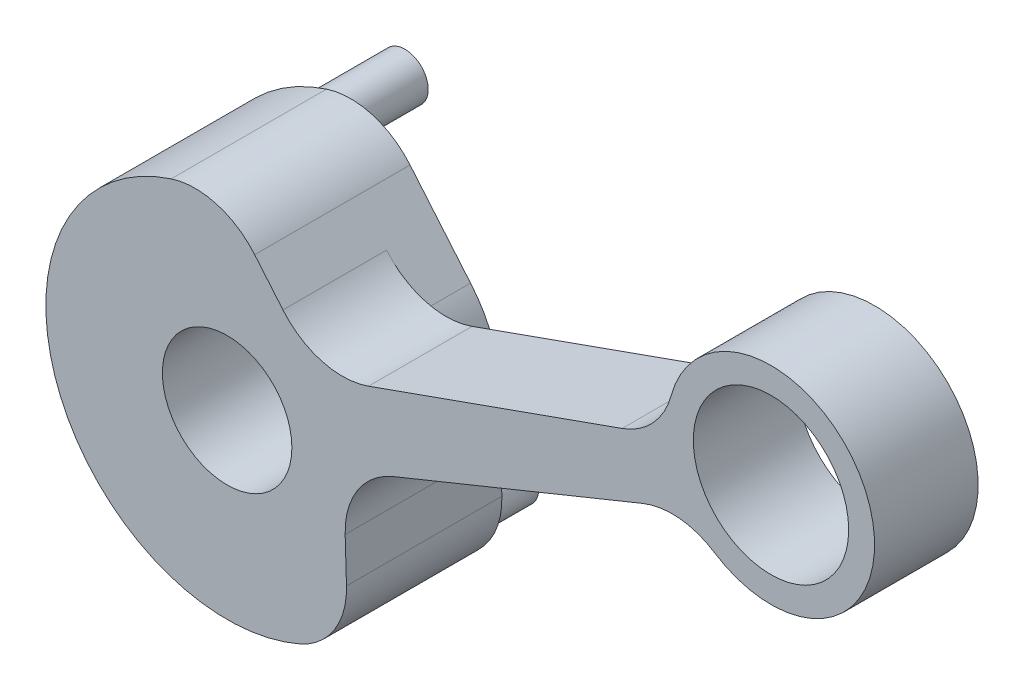
ISO-10303-21;
HEADER;
FILE_DESCRIPTION(('STEP AP214'),'2;1');
FILE_NAME('part.step','',(''),(''),'','','');
FILE_SCHEMA(('AUTOMOTIVE_DESIGN { 1 0 10303 214 1 1 1 1 }'));
ENDSEC;
DATA;
#1=APPLICATION_CONTEXT('core data for automotive mechanical design processes');
#2=APPLICATION_PROTOCOL_DEFINITION('international standard','automotive_design',2000,#1);
#3=PRODUCT_CONTEXT('',#1,'mechanical');
#4=PRODUCT('Part','Part','',(#3));
#5=PRODUCT_RELATED_PRODUCT_CATEGORY('part','',(#4));
#6=PRODUCT_DEFINITION_FORMATION('','',#4);
#7=PRODUCT_DEFINITION_CONTEXT('part definition',#1,'design');
#8=PRODUCT_DEFINITION('design','',#6,#7);
#9=PRODUCT_DEFINITION_SHAPE('','',#8);
#10=(LENGTH_UNIT() NAMED_UNIT(*) SI_UNIT(.MILLI.,.METRE.));
#11=(NAMED_UNIT(*) PLANE_ANGLE_UNIT() SI_UNIT($,.RADIAN.));
#12=(NAMED_UNIT(*) SI_UNIT($,.STERADIAN.) SOLID_ANGLE_UNIT());
#13=UNCERTAINTY_MEASURE_WITH_UNIT(LENGTH_MEASURE(1.E-05),#10,'distance_accuracy_value','');
#14=(GEOMETRIC_REPRESENTATION_CONTEXT(3) GLOBAL_UNCERTAINTY_ASSIGNED_CONTEXT((#13)) GLOBAL_UNIT_ASSIGNED_CONTEXT((#10,
#11,#12)) REPRESENTATION_CONTEXT('',''));
#15=CARTESIAN_POINT('',(0.,0.,0.));
#16=DIRECTION('',(0.,0.,1.));
#17=DIRECTION('',(1.,0.,0.));
#18=AXIS2_PLACEMENT_3D('',#15,#16,#17);
#19=CARTESIAN_POINT('',(0.,0.,0.));
#20=DIRECTION('',(0.,0.,1.));
#21=DIRECTION('',(1.,0.,0.));
#22=AXIS2_PLACEMENT_3D('',#19,#20,#21);
#23=PLANE('',#22);
#24=CARTESIAN_POINT('',(21.,8.,0.));
#25=DIRECTION('',(0.,0.,1.));
#26=DIRECTION('',(1.,0.,0.));
#27=AXIS2_PLACEMENT_3D('',#24,#25,#26);
#28=CIRCLE('',#27,3.);
#29=CARTESIAN_POINT('',(24.,8.,0.));
#30=VERTEX_POINT('',#29);
#31=EDGE_CURVE('E235',#30,#30,#28,.T.);
#32=ORIENTED_EDGE('',*,*,#31,.T.);
#33=EDGE_LOOP('',(#32));
#34=FACE_BOUND('',#33,.T.);
#35=DIRECTION('',(0.642768314001691,-0.766060633706904,0.));
#36=VECTOR('',#35,1.);
#37=CARTESIAN_POINT('',(3.44679651365598,2.89205773839203,0.));
#38=LINE('',#37,#36);
#39=CARTESIAN_POINT('',(2.15513883452,4.43147416365268,0.));
#40=VERTEX_POINT('',#39);
#41=CARTESIAN_POINT('',(3.39871404419549,2.94936312545409,0.));
#42=VERTEX_POINT('',#41);
#43=EDGE_CURVE('E12',#40,#42,#38,.T.);
#44=ORIENTED_EDGE('',*,*,#43,.F.);
#45=CARTESIAN_POINT('',(4.45332073564071,6.35977910565776,0.));
#46=DIRECTION('',(0.,0.,1.));
#47=DIRECTION('',(1.,0.,0.));
#48=AXIS2_PLACEMENT_3D('',#45,#46,#47);
#49=CIRCLE('',#48,3.);
#50=CARTESIAN_POINT('',(5.45868165986985,3.53325307322269,0.));
#51=VERTEX_POINT('',#50);
#52=EDGE_CURVE('E295',#40,#51,#49,.T.);
#53=ORIENTED_EDGE('',*,*,#52,.T.);
#54=DIRECTION('',(0.942175344145023,0.33512030807638,0.));
#55=VECTOR('',#54,1.);
#56=CARTESIAN_POINT('',(-0.50255608243628,1.41291332846847,0.));
#57=LINE('',#56,#55);
#58=CARTESIAN_POINT('',(15.2524150031694,7.01676487983104,0.));
#59=VERTEX_POINT('',#58);
#60=EDGE_CURVE('E268',#51,#59,#57,.T.);
#61=ORIENTED_EDGE('',*,*,#60,.T.);
#62=CARTESIAN_POINT('',(14.2470540789403,9.84329091226611,0.));
#63=DIRECTION('',(0.,0.,1.));
#64=DIRECTION('',(1.,0.,0.));
#65=AXIS2_PLACEMENT_3D('',#62,#63,#64);
#66=CIRCLE('',#65,3.);
#67=CARTESIAN_POINT('',(17.1411737593944,9.05330909272349,0.));
#68=VERTEX_POINT('',#67);
#69=EDGE_CURVE('E327',#59,#68,#66,.T.);
#70=ORIENTED_EDGE('',*,*,#69,.T.);
#71=CARTESIAN_POINT('',(21.,8.,0.));
#72=DIRECTION('',(0.,0.,1.));
#73=DIRECTION('',(1.,0.,0.));
#74=AXIS2_PLACEMENT_3D('',#71,#72,#73);
#75=CIRCLE('',#74,4.);
#76=CARTESIAN_POINT('',(18.8200680444491,4.646211594455,0.));
#77=VERTEX_POINT('',#76);
#78=EDGE_CURVE('E264',#77,#68,#75,.T.);
#79=ORIENTED_EDGE('',*,*,#78,.F.);
#80=CARTESIAN_POINT('',(17.1851190777859,2.13087029029626,0.));
#81=DIRECTION('',(0.,0.,1.));
#82=DIRECTION('',(1.,0.,0.));
#83=AXIS2_PLACEMENT_3D('',#80,#81,#82);
#84=CIRCLE('',#83,3.);
#85=CARTESIAN_POINT('',(16.0550365461745,4.90988332944282,0.));
#86=VERTEX_POINT('',#85);
#87=EDGE_CURVE('E322',#77,#86,#84,.T.);
#88=ORIENTED_EDGE('',*,*,#87,.T.);
#89=DIRECTION('',(0.92633767971552,0.376694177203826,0.));
#90=VECTOR('',#89,1.);
#91=CARTESIAN_POINT('',(0.564901456013718,-1.38916270996278,0.));
#92=LINE('',#91,#90);
#93=CARTESIAN_POINT('',(6.42593270965101,0.994219067547162,0.));
#94=VERTEX_POINT('',#93);
#95=EDGE_CURVE('E220',#94,#86,#92,.T.);
#96=ORIENTED_EDGE('',*,*,#95,.F.);
#97=CARTESIAN_POINT('',(7.55601524126248,-1.7847939715994,0.));
#98=DIRECTION('',(0.,0.,1.));
#99=DIRECTION('',(1.,0.,0.));
#100=AXIS2_PLACEMENT_3D('',#97,#98,#99);
#101=CIRCLE('',#100,3.);
#102=CARTESIAN_POINT('',(4.55735180119077,-1.87433487385811,0.));
#103=VERTEX_POINT('',#102);
#104=EDGE_CURVE('E301',#94,#103,#101,.T.);
#105=ORIENTED_EDGE('',*,*,#104,.T.);
#106=DIRECTION('',(-0.0298469674195689,0.999554480023903,0.));
#107=VECTOR('',#106,1.);
#108=CARTESIAN_POINT('',(4.49737363514461,0.134292794484378,0.));
#109=LINE('',#108,#107);
#110=CARTESIAN_POINT('',(4.49960634616688,0.0595208327792371,0.));
#111=VERTEX_POINT('',#110);
#112=EDGE_CURVE('E78',#103,#111,#109,.T.);
#113=ORIENTED_EDGE('',*,*,#112,.T.);
#114=CARTESIAN_POINT('',(0.,0.,0.));
#115=DIRECTION('',(0.,0.,1.));
#116=DIRECTION('',(1.,0.,0.));
#117=AXIS2_PLACEMENT_3D('',#114,#115,#116);
#118=CIRCLE('',#117,4.5);
#119=EDGE_CURVE('E225',#111,#42,#118,.T.);
#120=ORIENTED_EDGE('',*,*,#119,.T.);
#121=EDGE_LOOP('',(#44,#53,#61,#70,#79,#88,#96,#105,#113,#120));
#122=FACE_BOUND('',#121,.T.);
#123=ADVANCED_FACE('F68',(#34,#122),#23,.F.);
#124=CARTESIAN_POINT('',(4.49737363514461,0.134292794484378,4.));
#125=DIRECTION('',(-0.999554480023903,-0.0298469674195689,0.));
#126=DIRECTION('',(0.0298469674195689,-0.999554480023903,0.));
#127=AXIS2_PLACEMENT_3D('',#124,#125,#126);
#128=PLANE('',#127);
#129=DIRECTION('',(0.,0.,-1.));
#130=VECTOR('',#129,1.);
#131=CARTESIAN_POINT('',(4.60805665809094,-3.5724057753697,4.));
#132=LINE('',#131,#130);
#133=CARTESIAN_POINT('',(4.60805665809094,-3.5724057753697,4.));
#134=VERTEX_POINT('',#133);
#135=CARTESIAN_POINT('',(4.60805665809094,-3.5724057753697,-2.));
#136=VERTEX_POINT('',#135);
#137=EDGE_CURVE('E260',#134,#136,#132,.T.);
#138=ORIENTED_EDGE('',*,*,#137,.T.);
#139=DIRECTION('',(-0.0298469674195689,0.999554480023903,0.));
#140=VECTOR('',#139,1.);
#141=CARTESIAN_POINT('',(4.49737363514461,0.134292794484378,-2.));
#142=LINE('',#141,#140);
#143=CARTESIAN_POINT('',(4.49960634616688,0.0595208327792371,-2.));
#144=VERTEX_POINT('',#143);
#145=EDGE_CURVE('E210',#136,#144,#142,.T.);
#146=ORIENTED_EDGE('',*,*,#145,.T.);
#147=DIRECTION('',(0.,0.,1.));
#148=VECTOR('',#147,1.);
#149=CARTESIAN_POINT('',(4.49960634616688,0.0595208327792371,-2.));
#150=LINE('',#149,#148);
#151=EDGE_CURVE('E213',#144,#111,#150,.T.);
#152=ORIENTED_EDGE('',*,*,#151,.T.);
#153=ORIENTED_EDGE('',*,*,#112,.F.);
#154=DIRECTION('',(0.,0.,-1.));
#155=VECTOR('',#154,1.);
#156=CARTESIAN_POINT('',(4.55735180119077,-1.8743348738581,4.));
#157=LINE('',#156,#155);
#158=CARTESIAN_POINT('',(4.55735180119077,-1.87433487385811,4.));
#159=VERTEX_POINT('',#158);
#160=EDGE_CURVE('E292',#103,#159,#157,.F.);
#161=ORIENTED_EDGE('',*,*,#160,.T.);
#162=DIRECTION('',(-0.0298469674195689,0.999554480023903,0.));
#163=VECTOR('',#162,1.);
#164=CARTESIAN_POINT('',(4.49737363514461,0.134292794484378,4.));
#165=LINE('',#164,#163);
#166=EDGE_CURVE('E230',#134,#159,#165,.T.);
#167=ORIENTED_EDGE('',*,*,#166,.F.);
#168=EDGE_LOOP('',(#138,#146,#152,#153,#161,#167));
#169=FACE_BOUND('',#168,.T.);
#170=ADVANCED_FACE('F382',(#169),#128,.F.);
#171=CARTESIAN_POINT('',(0.564901456013718,-1.38916270996278,4.));
#172=DIRECTION('',(-0.376694177203826,0.92633767971552,0.));
#173=DIRECTION('',(-0.92633767971552,-0.376694177203826,0.));
#174=AXIS2_PLACEMENT_3D('',#171,#172,#173);
#175=PLANE('',#174);
#176=ORIENTED_EDGE('',*,*,#95,.T.);
#177=DIRECTION('',(0.,0.,1.));
#178=VECTOR('',#177,1.);
#179=CARTESIAN_POINT('',(16.0550365461745,4.90988332944282,4.));
#180=LINE('',#179,#178);
#181=CARTESIAN_POINT('',(16.0550365461745,4.90988332944282,4.));
#182=VERTEX_POINT('',#181);
#183=EDGE_CURVE('E315',#86,#182,#180,.T.);
#184=ORIENTED_EDGE('',*,*,#183,.T.);
#185=DIRECTION('',(0.92633767971552,0.376694177203826,0.));
#186=VECTOR('',#185,1.);
#187=CARTESIAN_POINT('',(0.564901456013718,-1.38916270996278,4.));
#188=LINE('',#187,#186);
#189=CARTESIAN_POINT('',(6.42593270965101,0.994219067547162,4.));
#190=VERTEX_POINT('',#189);
#191=EDGE_CURVE('E234',#190,#182,#188,.T.);
#192=ORIENTED_EDGE('',*,*,#191,.F.);
#193=DIRECTION('',(0.,0.,-1.));
#194=VECTOR('',#193,1.);
#195=CARTESIAN_POINT('',(6.42593270965101,0.994219067547161,0.));
#196=LINE('',#195,#194);
#197=EDGE_CURVE('E288',#190,#94,#196,.T.);
#198=ORIENTED_EDGE('',*,*,#197,.T.);
#199=EDGE_LOOP('',(#176,#184,#192,#198));
#200=FACE_BOUND('',#199,.T.);
#201=ADVANCED_FACE('F368',(#200),#175,.F.);
#202=CARTESIAN_POINT('',(21.,8.,4.));
#203=DIRECTION('',(0.,0.,-1.));
#204=DIRECTION('',(-1.,0.,0.));
#205=AXIS2_PLACEMENT_3D('',#202,#203,#204);
#206=CYLINDRICAL_SURFACE('',#205,4.);
#207=CARTESIAN_POINT('',(21.,8.,4.));
#208=DIRECTION('',(0.,0.,1.));
#209=DIRECTION('',(1.,0.,0.));
#210=AXIS2_PLACEMENT_3D('',#207,#208,#209);
#211=CIRCLE('',#210,4.);
#212=CARTESIAN_POINT('',(18.8200680444491,4.646211594455,4.));
#213=VERTEX_POINT('',#212);
#214=CARTESIAN_POINT('',(17.1411737593944,9.05330909272349,4.));
#215=VERTEX_POINT('',#214);
#216=EDGE_CURVE('E239',#213,#215,#211,.T.);
#217=ORIENTED_EDGE('',*,*,#216,.F.);
#218=DIRECTION('',(0.,0.,-1.));
#219=VECTOR('',#218,1.);
#220=CARTESIAN_POINT('',(18.8200680444491,4.646211594455,4.));
#221=LINE('',#220,#219);
#222=EDGE_CURVE('E311',#213,#77,#221,.T.);
#223=ORIENTED_EDGE('',*,*,#222,.T.);
#224=ORIENTED_EDGE('',*,*,#78,.T.);
#225=DIRECTION('',(0.,0.,-1.));
#226=VECTOR('',#225,1.);
#227=CARTESIAN_POINT('',(17.1411737593944,9.05330909272349,4.));
#228=LINE('',#227,#226);
#229=EDGE_CURVE('E308',#68,#215,#228,.F.);
#230=ORIENTED_EDGE('',*,*,#229,.T.);
#231=EDGE_LOOP('',(#217,#223,#224,#230));
#232=FACE_BOUND('',#231,.T.);
#233=ADVANCED_FACE('F338',(#232),#206,.T.);
#234=CARTESIAN_POINT('',(-0.50255608243628,1.41291332846847,4.));
#235=DIRECTION('',(-0.33512030807638,0.942175344145023,0.));
#236=DIRECTION('',(-0.942175344145023,-0.33512030807638,0.));
#237=AXIS2_PLACEMENT_3D('',#234,#235,#236);
#238=PLANE('',#237);
#239=DIRECTION('',(0.942175344145023,0.33512030807638,0.));
#240=VECTOR('',#239,1.);
#241=CARTESIAN_POINT('',(-0.50255608243628,1.41291332846847,4.));
#242=LINE('',#241,#240);
#243=CARTESIAN_POINT('',(5.45868165986985,3.53325307322269,4.));
#244=VERTEX_POINT('',#243);
#245=CARTESIAN_POINT('',(15.2524150031694,7.01676487983104,4.));
#246=VERTEX_POINT('',#245);
#247=EDGE_CURVE('E242',#244,#246,#242,.T.);
#248=ORIENTED_EDGE('',*,*,#247,.T.);
#249=DIRECTION('',(0.,0.,-1.));
#250=VECTOR('',#249,1.);
#251=CARTESIAN_POINT('',(15.2524150031694,7.01676487983104,4.));
#252=LINE('',#251,#250);
#253=EDGE_CURVE('E318',#246,#59,#252,.T.);
#254=ORIENTED_EDGE('',*,*,#253,.T.);
#255=ORIENTED_EDGE('',*,*,#60,.F.);
#256=DIRECTION('',(0.,0.,-1.));
#257=VECTOR('',#256,1.);
#258=CARTESIAN_POINT('',(5.45868165986985,3.53325307322269,4.));
#259=LINE('',#258,#257);
#260=EDGE_CURVE('E285',#51,#244,#259,.F.);
#261=ORIENTED_EDGE('',*,*,#260,.T.);
#262=EDGE_LOOP('',(#248,#254,#255,#261));
#263=FACE_BOUND('',#262,.T.);
#264=ADVANCED_FACE('F341',(#263),#238,.T.);
#265=CARTESIAN_POINT('',(3.44679651365598,2.89205773839203,4.));
#266=DIRECTION('',(0.766060633706904,0.642768314001691,0.));
#267=DIRECTION('',(-0.642768314001691,0.766060633706904,0.));
#268=AXIS2_PLACEMENT_3D('',#265,#266,#267);
#269=PLANE('',#268);
#270=DIRECTION('',(0.642768314001691,-0.766060633706904,0.));
#271=VECTOR('',#270,1.);
#272=CARTESIAN_POINT('',(3.44679651365598,2.89205773839203,4.));
#273=LINE('',#272,#271);
#274=CARTESIAN_POINT('',(1.06318617737835,5.73287923650085,4.));
#275=VERTEX_POINT('',#274);
#276=CARTESIAN_POINT('',(2.15513883452,4.43147416365268,4.));
#277=VERTEX_POINT('',#276);
#278=EDGE_CURVE('E245',#275,#277,#273,.T.);
#279=ORIENTED_EDGE('',*,*,#278,.T.);
#280=DIRECTION('',(0.,0.,-1.));
#281=VECTOR('',#280,1.);
#282=CARTESIAN_POINT('',(2.15513883452,4.43147416365268,0.));
#283=LINE('',#282,#281);
#284=EDGE_CURVE('E184',#277,#40,#283,.T.);
#285=ORIENTED_EDGE('',*,*,#284,.T.);
#286=ORIENTED_EDGE('',*,*,#43,.T.);
#287=DIRECTION('',(0.,0.,1.));
#288=VECTOR('',#287,1.);
#289=CARTESIAN_POINT('',(3.39871404419549,2.94936312545409,-2.));
#290=LINE('',#289,#288);
#291=CARTESIAN_POINT('',(3.39871404419549,2.94936312545409,-2.));
#292=VERTEX_POINT('',#291);
#293=EDGE_CURVE('E86',#292,#42,#290,.T.);
#294=ORIENTED_EDGE('',*,*,#293,.F.);
#295=DIRECTION('',(0.642768314001691,-0.766060633706904,0.));
#296=VECTOR('',#295,1.);
#297=CARTESIAN_POINT('',(3.44679651365598,2.89205773839203,-2.));
#298=LINE('',#297,#296);
#299=CARTESIAN_POINT('',(1.06318617737835,5.73287923650085,-2.));
#300=VERTEX_POINT('',#299);
#301=EDGE_CURVE('E188',#300,#292,#298,.T.);
#302=ORIENTED_EDGE('',*,*,#301,.F.);
#303=DIRECTION('',(0.,0.,-1.));
#304=VECTOR('',#303,1.);
#305=CARTESIAN_POINT('',(1.06318617737835,5.73287923650085,4.));
#306=LINE('',#305,#304);
#307=EDGE_CURVE('E173',#275,#300,#306,.T.);
#308=ORIENTED_EDGE('',*,*,#307,.F.);
#309=EDGE_LOOP('',(#279,#285,#286,#294,#302,#308));
#310=FACE_BOUND('',#309,.T.);
#311=ADVANCED_FACE('F189',(#310),#269,.T.);
#312=CARTESIAN_POINT('',(-1.23499572374236,3.80457429449578,4.));
#313=DIRECTION('',(0.,0.,-1.));
#314=DIRECTION('',(-1.,0.,0.));
#315=AXIS2_PLACEMENT_3D('',#312,#313,#314);
#316=CYLINDRICAL_SURFACE('',#315,3.);
#317=ORIENTED_EDGE('',*,*,#307,.T.);
#318=CARTESIAN_POINT('',(-1.23499572374236,3.80457429449578,-2.));
#319=DIRECTION('',(0.,0.,1.));
#320=DIRECTION('',(1.,0.,0.));
#321=AXIS2_PLACEMENT_3D('',#318,#319,#320);
#322=CIRCLE('',#321,3.);
#323=CARTESIAN_POINT('',(-2.16124251654913,6.65800501536762,-2.));
#324=VERTEX_POINT('',#323);
#325=EDGE_CURVE('E178',#300,#324,#322,.T.);
#326=ORIENTED_EDGE('',*,*,#325,.T.);
#327=DIRECTION('',(0.,0.,-1.));
#328=VECTOR('',#327,1.);
#329=CARTESIAN_POINT('',(-2.16124251654913,6.65800501536762,4.));
#330=LINE('',#329,#328);
#331=CARTESIAN_POINT('',(-2.16124251654913,6.65800501536762,4.));
#332=VERTEX_POINT('',#331);
#333=EDGE_CURVE('E185',#332,#324,#330,.T.);
#334=ORIENTED_EDGE('',*,*,#333,.F.);
#335=CARTESIAN_POINT('',(-1.23499572374236,3.80457429449578,4.));
#336=DIRECTION('',(0.,0.,1.));
#337=DIRECTION('',(1.,0.,0.));
#338=AXIS2_PLACEMENT_3D('',#335,#336,#337);
#339=CIRCLE('',#338,3.);
#340=EDGE_CURVE('E179',#275,#332,#339,.T.);
#341=ORIENTED_EDGE('',*,*,#340,.F.);
#342=EDGE_LOOP('',(#317,#326,#334,#341));
#343=FACE_BOUND('',#342,.T.);
#344=ADVANCED_FACE('F175',(#343),#316,.T.);
#345=CARTESIAN_POINT('',(0.,0.,4.));
#346=DIRECTION('',(0.,0.,-1.));
#347=DIRECTION('',(-1.,0.,0.));
#348=AXIS2_PLACEMENT_3D('',#345,#346,#347);
#349=CYLINDRICAL_SURFACE('',#348,7.);
#350=ORIENTED_EDGE('',*,*,#333,.T.);
#351=CARTESIAN_POINT('',(0.,0.,-2.));
#352=DIRECTION('',(0.,0.,1.));
#353=DIRECTION('',(1.,0.,0.));
#354=AXIS2_PLACEMENT_3D('',#351,#352,#353);
#355=CIRCLE('',#354,7.);
#356=CARTESIAN_POINT('',(2.81643813153366,-6.4084066858497,-2.));
#357=VERTEX_POINT('',#356);
#358=EDGE_CURVE('E199',#324,#357,#355,.T.);
#359=ORIENTED_EDGE('',*,*,#358,.T.);
#360=DIRECTION('',(0.,0.,-1.));
#361=VECTOR('',#360,1.);
#362=CARTESIAN_POINT('',(2.81643813153366,-6.4084066858497,4.));
#363=LINE('',#362,#361);
#364=CARTESIAN_POINT('',(2.81643813153366,-6.4084066858497,4.));
#365=VERTEX_POINT('',#364);
#366=EDGE_CURVE('E277',#365,#357,#363,.T.);
#367=ORIENTED_EDGE('',*,*,#366,.F.);
#368=CARTESIAN_POINT('',(0.,0.,4.));
#369=DIRECTION('',(0.,0.,1.));
#370=DIRECTION('',(1.,0.,0.));
#371=AXIS2_PLACEMENT_3D('',#368,#369,#370);
#372=CIRCLE('',#371,7.);
#373=EDGE_CURVE('E250',#332,#365,#372,.T.);
#374=ORIENTED_EDGE('',*,*,#373,.F.);
#375=EDGE_LOOP('',(#350,#359,#367,#374));
#376=FACE_BOUND('',#375,.T.);
#377=ADVANCED_FACE('F353',(#376),#349,.T.);
#378=CARTESIAN_POINT('',(1.60939321801923,-3.6619466776284,4.));
#379=DIRECTION('',(0.,0.,-1.));
#380=DIRECTION('',(-1.,0.,0.));
#381=AXIS2_PLACEMENT_3D('',#378,#379,#380);
#382=CYLINDRICAL_SURFACE('',#381,3.);
#383=ORIENTED_EDGE('',*,*,#366,.T.);
#384=CARTESIAN_POINT('',(1.60939321801923,-3.6619466776284,-2.));
#385=DIRECTION('',(0.,0.,1.));
#386=DIRECTION('',(1.,0.,0.));
#387=AXIS2_PLACEMENT_3D('',#384,#385,#386);
#388=CIRCLE('',#387,3.);
#389=EDGE_CURVE('E203',#357,#136,#388,.T.);
#390=ORIENTED_EDGE('',*,*,#389,.T.);
#391=ORIENTED_EDGE('',*,*,#137,.F.);
#392=CARTESIAN_POINT('',(1.60939321801923,-3.6619466776284,4.));
#393=DIRECTION('',(0.,0.,1.));
#394=DIRECTION('',(1.,0.,0.));
#395=AXIS2_PLACEMENT_3D('',#392,#393,#394);
#396=CIRCLE('',#395,3.);
#397=EDGE_CURVE('E253',#365,#134,#396,.T.);
#398=ORIENTED_EDGE('',*,*,#397,.F.);
#399=EDGE_LOOP('',(#383,#390,#391,#398));
#400=FACE_BOUND('',#399,.T.);
#401=ADVANCED_FACE('F357',(#400),#382,.T.);
#402=CARTESIAN_POINT('',(21.,8.,4.));
#403=DIRECTION('',(0.,0.,-1.));
#404=DIRECTION('',(-1.,0.,0.));
#405=AXIS2_PLACEMENT_3D('',#402,#403,#404);
#406=CYLINDRICAL_SURFACE('',#405,3.);
#407=CARTESIAN_POINT('',(21.,8.,4.));
#408=DIRECTION('',(0.,0.,1.));
#409=DIRECTION('',(1.,0.,0.));
#410=AXIS2_PLACEMENT_3D('',#407,#408,#409);
#411=CIRCLE('',#410,3.);
#412=CARTESIAN_POINT('',(24.,8.,4.));
#413=VERTEX_POINT('',#412);
#414=EDGE_CURVE('E256',#413,#413,#411,.T.);
#415=ORIENTED_EDGE('',*,*,#414,.T.);
#416=EDGE_LOOP('',(#415));
#417=FACE_BOUND('',#416,.T.);
#418=ORIENTED_EDGE('',*,*,#31,.F.);
#419=EDGE_LOOP('',(#418));
#420=FACE_BOUND('',#419,.T.);
#421=ADVANCED_FACE('F392',(#417,#420),#406,.F.);
#422=CARTESIAN_POINT('',(0.,0.,4.));
#423=DIRECTION('',(0.,0.,1.));
#424=DIRECTION('',(1.,0.,0.));
#425=AXIS2_PLACEMENT_3D('',#422,#423,#424);
#426=PLANE('',#425);
#427=CARTESIAN_POINT('',(0.,0.,4.));
#428=DIRECTION('',(0.,0.,1.));
#429=DIRECTION('',(1.,0.,0.));
#430=AXIS2_PLACEMENT_3D('',#427,#428,#429);
#431=CIRCLE('',#430,2.5);
#432=CARTESIAN_POINT('',(2.5,0.,4.));
#433=VERTEX_POINT('',#432);
#434=EDGE_CURVE('E420',#433,#433,#431,.T.);
#435=ORIENTED_EDGE('',*,*,#434,.F.);
#436=EDGE_LOOP('',(#435));
#437=FACE_BOUND('',#436,.T.);
#438=ORIENTED_EDGE('',*,*,#166,.T.);
#439=CARTESIAN_POINT('',(7.55601524126248,-1.7847939715994,4.));
#440=DIRECTION('',(0.,0.,1.));
#441=DIRECTION('',(1.,0.,0.));
#442=AXIS2_PLACEMENT_3D('',#439,#440,#441);
#443=CIRCLE('',#442,3.);
#444=EDGE_CURVE('E305',#159,#190,#443,.F.);
#445=ORIENTED_EDGE('',*,*,#444,.T.);
#446=ORIENTED_EDGE('',*,*,#191,.T.);
#447=CARTESIAN_POINT('',(17.1851190777859,2.13087029029626,4.));
#448=DIRECTION('',(0.,0.,1.));
#449=DIRECTION('',(1.,0.,0.));
#450=AXIS2_PLACEMENT_3D('',#447,#448,#449);
#451=CIRCLE('',#450,3.);
#452=EDGE_CURVE('E325',#182,#213,#451,.F.);
#453=ORIENTED_EDGE('',*,*,#452,.T.);
#454=ORIENTED_EDGE('',*,*,#216,.T.);
#455=CARTESIAN_POINT('',(14.2470540789403,9.84329091226611,4.));
#456=DIRECTION('',(0.,0.,1.));
#457=DIRECTION('',(1.,0.,0.));
#458=AXIS2_PLACEMENT_3D('',#455,#456,#457);
#459=CIRCLE('',#458,3.);
#460=EDGE_CURVE('E72',#215,#246,#459,.F.);
#461=ORIENTED_EDGE('',*,*,#460,.T.);
#462=ORIENTED_EDGE('',*,*,#247,.F.);
#463=CARTESIAN_POINT('',(4.45332073564071,6.35977910565776,4.));
#464=DIRECTION('',(0.,0.,1.));
#465=DIRECTION('',(1.,0.,0.));
#466=AXIS2_PLACEMENT_3D('',#463,#464,#465);
#467=CIRCLE('',#466,3.);
#468=EDGE_CURVE('E298',#244,#277,#467,.F.);
#469=ORIENTED_EDGE('',*,*,#468,.T.);
#470=ORIENTED_EDGE('',*,*,#278,.F.);
#471=ORIENTED_EDGE('',*,*,#340,.T.);
#472=ORIENTED_EDGE('',*,*,#373,.T.);
#473=ORIENTED_EDGE('',*,*,#397,.T.);
#474=EDGE_LOOP('',(#438,#445,#446,#453,#454,#461,#462,#469,#470,#471,#472,#473));
#475=FACE_BOUND('',#474,.T.);
#476=ORIENTED_EDGE('',*,*,#414,.F.);
#477=EDGE_LOOP('',(#476));
#478=FACE_BOUND('',#477,.T.);
#479=ADVANCED_FACE('F344',(#437,#475,#478),#426,.T.);
#480=CARTESIAN_POINT('',(4.45332073564071,6.35977910565776,4.));
#481=DIRECTION('',(0.,0.,1.));
#482=DIRECTION('',(1.,0.,0.));
#483=AXIS2_PLACEMENT_3D('',#480,#481,#482);
#484=CYLINDRICAL_SURFACE('',#483,3.);
#485=ORIENTED_EDGE('',*,*,#468,.F.);
#486=ORIENTED_EDGE('',*,*,#260,.F.);
#487=ORIENTED_EDGE('',*,*,#52,.F.);
#488=ORIENTED_EDGE('',*,*,#284,.F.);
#489=EDGE_LOOP('',(#485,#486,#487,#488));
#490=FACE_BOUND('',#489,.T.);
#491=ADVANCED_FACE('F348',(#490),#484,.F.);
#492=CARTESIAN_POINT('',(7.55601524126248,-1.7847939715994,4.));
#493=DIRECTION('',(0.,0.,1.));
#494=DIRECTION('',(1.,0.,0.));
#495=AXIS2_PLACEMENT_3D('',#492,#493,#494);
#496=CYLINDRICAL_SURFACE('',#495,3.);
#497=ORIENTED_EDGE('',*,*,#444,.F.);
#498=ORIENTED_EDGE('',*,*,#160,.F.);
#499=ORIENTED_EDGE('',*,*,#104,.F.);
#500=ORIENTED_EDGE('',*,*,#197,.F.);
#501=EDGE_LOOP('',(#497,#498,#499,#500));
#502=FACE_BOUND('',#501,.T.);
#503=ADVANCED_FACE('F365',(#502),#496,.F.);
#504=CARTESIAN_POINT('',(17.1851190777859,2.13087029029626,4.));
#505=DIRECTION('',(0.,0.,-1.));
#506=DIRECTION('',(-1.,0.,0.));
#507=AXIS2_PLACEMENT_3D('',#504,#505,#506);
#508=CYLINDRICAL_SURFACE('',#507,3.);
#509=ORIENTED_EDGE('',*,*,#452,.F.);
#510=ORIENTED_EDGE('',*,*,#183,.F.);
#511=ORIENTED_EDGE('',*,*,#87,.F.);
#512=ORIENTED_EDGE('',*,*,#222,.F.);
#513=EDGE_LOOP('',(#509,#510,#511,#512));
#514=FACE_BOUND('',#513,.T.);
#515=ADVANCED_FACE('F372',(#514),#508,.F.);
#516=CARTESIAN_POINT('',(14.2470540789403,9.84329091226611,4.));
#517=DIRECTION('',(0.,0.,-1.));
#518=DIRECTION('',(-1.,0.,0.));
#519=AXIS2_PLACEMENT_3D('',#516,#517,#518);
#520=CYLINDRICAL_SURFACE('',#519,3.);
#521=ORIENTED_EDGE('',*,*,#460,.F.);
#522=ORIENTED_EDGE('',*,*,#229,.F.);
#523=ORIENTED_EDGE('',*,*,#69,.F.);
#524=ORIENTED_EDGE('',*,*,#253,.F.);
#525=EDGE_LOOP('',(#521,#522,#523,#524));
#526=FACE_BOUND('',#525,.T.);
#527=ADVANCED_FACE('F70',(#526),#520,.F.);
#528=CARTESIAN_POINT('',(0.,0.,-2.));
#529=DIRECTION('',(0.,0.,1.));
#530=DIRECTION('',(1.,0.,0.));
#531=AXIS2_PLACEMENT_3D('',#528,#529,#530);
#532=PLANE('',#531);
#533=CARTESIAN_POINT('',(-2.13597196555195,5.6069264095738,-2.));
#534=DIRECTION('',(0.,0.,1.));
#535=DIRECTION('',(1.,0.,0.));
#536=AXIS2_PLACEMENT_3D('',#533,#534,#535);
#537=CIRCLE('',#536,0.9);
#538=CARTESIAN_POINT('',(-1.23597196555195,5.6069264095738,-2.));
#539=VERTEX_POINT('',#538);
#540=EDGE_CURVE('E440',#539,#539,#537,.T.);
#541=ORIENTED_EDGE('',*,*,#540,.T.);
#542=EDGE_LOOP('',(#541));
#543=FACE_BOUND('',#542,.T.);
#544=CARTESIAN_POINT('',(2.13597196555191,-5.60692640957381,-2.));
#545=DIRECTION('',(0.,0.,-1.));
#546=DIRECTION('',(-1.,0.,0.));
#547=AXIS2_PLACEMENT_3D('',#544,#545,#546);
#548=CIRCLE('',#547,0.9);
#549=CARTESIAN_POINT('',(1.23597196555191,-5.60692640957381,-2.));
#550=VERTEX_POINT('',#549);
#551=EDGE_CURVE('E434',#550,#550,#548,.F.);
#552=ORIENTED_EDGE('',*,*,#551,.T.);
#553=EDGE_LOOP('',(#552));
#554=FACE_BOUND('',#553,.T.);
#555=CARTESIAN_POINT('',(-5.60692640957382,-2.13597196555189,-2.));
#556=DIRECTION('',(0.,0.,-1.));
#557=DIRECTION('',(-1.,0.,0.));
#558=AXIS2_PLACEMENT_3D('',#555,#556,#557);
#559=CIRCLE('',#558,0.9);
#560=CARTESIAN_POINT('',(-6.50692640957382,-2.13597196555189,-2.));
#561=VERTEX_POINT('',#560);
#562=EDGE_CURVE('E429',#561,#561,#559,.F.);
#563=ORIENTED_EDGE('',*,*,#562,.T.);
#564=EDGE_LOOP('',(#563));
#565=FACE_BOUND('',#564,.T.);
#566=CARTESIAN_POINT('',(0.,0.,-2.));
#567=DIRECTION('',(0.,0.,1.));
#568=DIRECTION('',(1.,0.,0.));
#569=AXIS2_PLACEMENT_3D('',#566,#567,#568);
#570=CIRCLE('',#569,2.5);
#571=CARTESIAN_POINT('',(2.5,0.,-2.));
#572=VERTEX_POINT('',#571);
#573=EDGE_CURVE('E229',#572,#572,#570,.T.);
#574=ORIENTED_EDGE('',*,*,#573,.T.);
#575=EDGE_LOOP('',(#574));
#576=FACE_BOUND('',#575,.T.);
#577=ORIENTED_EDGE('',*,*,#301,.T.);
#578=CARTESIAN_POINT('',(0.,0.,-2.));
#579=DIRECTION('',(0.,0.,1.));
#580=DIRECTION('',(1.,0.,0.));
#581=AXIS2_PLACEMENT_3D('',#578,#579,#580);
#582=CIRCLE('',#581,4.5);
#583=EDGE_CURVE('E193',#144,#292,#582,.T.);
#584=ORIENTED_EDGE('',*,*,#583,.F.);
#585=ORIENTED_EDGE('',*,*,#145,.F.);
#586=ORIENTED_EDGE('',*,*,#389,.F.);
#587=ORIENTED_EDGE('',*,*,#358,.F.);
#588=ORIENTED_EDGE('',*,*,#325,.F.);
#589=EDGE_LOOP('',(#577,#584,#585,#586,#587,#588));
#590=FACE_BOUND('',#589,.T.);
#591=ADVANCED_FACE('F196',(#543,#554,#565,#576,#590),#532,.F.);
#592=CARTESIAN_POINT('',(0.,0.,-2.));
#593=DIRECTION('',(0.,0.,1.));
#594=DIRECTION('',(1.,0.,0.));
#595=AXIS2_PLACEMENT_3D('',#592,#593,#594);
#596=CYLINDRICAL_SURFACE('',#595,4.5);
#597=ORIENTED_EDGE('',*,*,#293,.T.);
#598=ORIENTED_EDGE('',*,*,#119,.F.);
#599=ORIENTED_EDGE('',*,*,#151,.F.);
#600=ORIENTED_EDGE('',*,*,#583,.T.);
#601=EDGE_LOOP('',(#597,#598,#599,#600));
#602=FACE_BOUND('',#601,.T.);
#603=ADVANCED_FACE('F378',(#602),#596,.T.);
#604=CARTESIAN_POINT('',(0.,0.,-2.));
#605=DIRECTION('',(0.,0.,1.));
#606=DIRECTION('',(1.,0.,0.));
#607=AXIS2_PLACEMENT_3D('',#604,#605,#606);
#608=CYLINDRICAL_SURFACE('',#607,2.5);
#609=ORIENTED_EDGE('',*,*,#573,.F.);
#610=EDGE_LOOP('',(#609));
#611=FACE_BOUND('',#610,.T.);
#612=ORIENTED_EDGE('',*,*,#434,.T.);
#613=EDGE_LOOP('',(#612));
#614=FACE_BOUND('',#613,.T.);
#615=ADVANCED_FACE('F480',(#611,#614),#608,.F.);
#616=CARTESIAN_POINT('',(-5.60692640957382,-2.13597196555189,-5.));
#617=DIRECTION('',(0.,0.,1.));
#618=DIRECTION('',(1.,0.,0.));
#619=AXIS2_PLACEMENT_3D('',#616,#617,#618);
#620=CYLINDRICAL_SURFACE('',#619,0.9);
#621=CARTESIAN_POINT('',(-5.60692640957382,-2.13597196555189,-5.));
#622=DIRECTION('',(0.,0.,-1.));
#623=DIRECTION('',(-1.,0.,0.));
#624=AXIS2_PLACEMENT_3D('',#621,#622,#623);
#625=CIRCLE('',#624,0.9);
#626=CARTESIAN_POINT('',(-6.50692640957382,-2.13597196555189,-5.));
#627=VERTEX_POINT('',#626);
#628=EDGE_CURVE('E423',#627,#627,#625,.F.);
#629=ORIENTED_EDGE('',*,*,#628,.T.);
#630=EDGE_LOOP('',(#629));
#631=FACE_BOUND('',#630,.T.);
#632=ORIENTED_EDGE('',*,*,#562,.F.);
#633=EDGE_LOOP('',(#632));
#634=FACE_BOUND('',#633,.T.);
#635=ADVANCED_FACE('F476',(#631,#634),#620,.T.);
#636=CARTESIAN_POINT('',(0.,0.,-5.));
#637=DIRECTION('',(0.,0.,-1.));
#638=DIRECTION('',(-1.,0.,0.));
#639=AXIS2_PLACEMENT_3D('',#636,#637,#638);
#640=PLANE('',#639);
#641=ORIENTED_EDGE('',*,*,#628,.F.);
#642=EDGE_LOOP('',(#641));
#643=FACE_BOUND('',#642,.T.);
#644=ADVANCED_FACE('F471',(#643),#640,.T.);
#645=CARTESIAN_POINT('',(2.13597196555191,-5.60692640957381,-5.));
#646=DIRECTION('',(0.,0.,1.));
#647=DIRECTION('',(1.,0.,0.));
#648=AXIS2_PLACEMENT_3D('',#645,#646,#647);
#649=CYLINDRICAL_SURFACE('',#648,0.9);
#650=CARTESIAN_POINT('',(2.13597196555191,-5.60692640957381,-5.));
#651=DIRECTION('',(0.,0.,-1.));
#652=DIRECTION('',(-1.,0.,0.));
#653=AXIS2_PLACEMENT_3D('',#650,#651,#652);
#654=CIRCLE('',#653,0.9);
#655=CARTESIAN_POINT('',(1.23597196555191,-5.60692640957381,-5.));
#656=VERTEX_POINT('',#655);
#657=EDGE_CURVE('E436',#656,#656,#654,.F.);
#658=ORIENTED_EDGE('',*,*,#657,.T.);
#659=EDGE_LOOP('',(#658));
#660=FACE_BOUND('',#659,.T.);
#661=ORIENTED_EDGE('',*,*,#551,.F.);
#662=EDGE_LOOP('',(#661));
#663=FACE_BOUND('',#662,.T.);
#664=ADVANCED_FACE('F466',(#660,#663),#649,.T.);
#665=CARTESIAN_POINT('',(0.,0.,-5.));
#666=DIRECTION('',(0.,0.,-1.));
#667=DIRECTION('',(-1.,0.,0.));
#668=AXIS2_PLACEMENT_3D('',#665,#666,#667);
#669=PLANE('',#668);
#670=ORIENTED_EDGE('',*,*,#657,.F.);
#671=EDGE_LOOP('',(#670));
#672=FACE_BOUND('',#671,.T.);
#673=ADVANCED_FACE('F457',(#672),#669,.T.);
#674=CARTESIAN_POINT('',(-2.13597196555195,5.6069264095738,-5.));
#675=DIRECTION('',(0.,0.,1.));
#676=DIRECTION('',(1.,0.,0.));
#677=AXIS2_PLACEMENT_3D('',#674,#675,#676);
#678=CYLINDRICAL_SURFACE('',#677,0.9);
#679=CARTESIAN_POINT('',(-2.13597196555195,5.6069264095738,-5.));
#680=DIRECTION('',(0.,0.,1.));
#681=DIRECTION('',(1.,0.,0.));
#682=AXIS2_PLACEMENT_3D('',#679,#680,#681);
#683=CIRCLE('',#682,0.9);
#684=CARTESIAN_POINT('',(-1.23597196555195,5.6069264095738,-5.));
#685=VERTEX_POINT('',#684);
#686=EDGE_CURVE('E444',#685,#685,#683,.T.);
#687=ORIENTED_EDGE('',*,*,#686,.T.);
#688=EDGE_LOOP('',(#687));
#689=FACE_BOUND('',#688,.T.);
#690=ORIENTED_EDGE('',*,*,#540,.F.);
#691=EDGE_LOOP('',(#690));
#692=FACE_BOUND('',#691,.T.);
#693=ADVANCED_FACE('F454',(#689,#692),#678,.T.);
#694=CARTESIAN_POINT('',(-2.13597196555195,5.6069264095738,-5.));
#695=DIRECTION('',(0.,0.,1.));
#696=DIRECTION('',(1.,0.,0.));
#697=AXIS2_PLACEMENT_3D('',#694,#695,#696);
#698=PLANE('',#697);
#699=ORIENTED_EDGE('',*,*,#686,.F.);
#700=EDGE_LOOP('',(#699));
#701=FACE_BOUND('',#700,.T.);
#702=ADVANCED_FACE('F456',(#701),#698,.F.);
#703=CLOSED_SHELL('',(#123,#170,#201,#233,#264,#311,#344,#377,#401,#421,#479,#491,#503,#515,
#527,#591,#603,#615,#635,#644,#664,#673,#693,#702));
#704=MANIFOLD_SOLID_BREP('B2',#703);
#705=ADVANCED_BREP_SHAPE_REPRESENTATION('',(#18,#704),#14);
#706=SHAPE_DEFINITION_REPRESENTATION(#9,#705);
ENDSEC;
END-ISO-10303-21;
